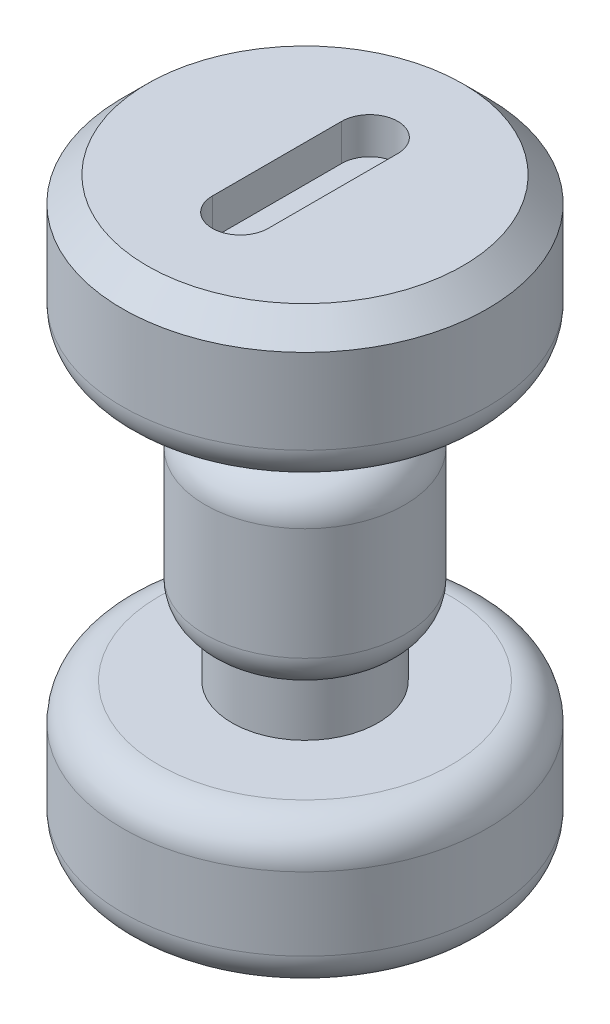
ISO-10303-21;
HEADER;
FILE_DESCRIPTION(('STEP AP214'),'2;1');
FILE_NAME('part.step','',(''),(''),'','','');
FILE_SCHEMA(('AUTOMOTIVE_DESIGN { 1 0 10303 214 1 1 1 1 }'));
ENDSEC;
DATA;
#1=APPLICATION_CONTEXT('core data for automotive mechanical design processes');
#2=APPLICATION_PROTOCOL_DEFINITION('international standard','automotive_design',2000,#1);
#3=PRODUCT_CONTEXT('',#1,'mechanical');
#4=PRODUCT('Part','Part','',(#3));
#5=PRODUCT_RELATED_PRODUCT_CATEGORY('part','',(#4));
#6=PRODUCT_DEFINITION_FORMATION('','',#4);
#7=PRODUCT_DEFINITION_CONTEXT('part definition',#1,'design');
#8=PRODUCT_DEFINITION('design','',#6,#7);
#9=PRODUCT_DEFINITION_SHAPE('','',#8);
#10=(LENGTH_UNIT() NAMED_UNIT(*) SI_UNIT(.MILLI.,.METRE.));
#11=(NAMED_UNIT(*) PLANE_ANGLE_UNIT() SI_UNIT($,.RADIAN.));
#12=(NAMED_UNIT(*) SI_UNIT($,.STERADIAN.) SOLID_ANGLE_UNIT());
#13=UNCERTAINTY_MEASURE_WITH_UNIT(LENGTH_MEASURE(1.E-05),#10,'distance_accuracy_value','');
#14=(GEOMETRIC_REPRESENTATION_CONTEXT(3) GLOBAL_UNCERTAINTY_ASSIGNED_CONTEXT((#13)) GLOBAL_UNIT_ASSIGNED_CONTEXT((#10,
#11,#12)) REPRESENTATION_CONTEXT('',''));
#15=CARTESIAN_POINT('',(0.,0.,0.));
#16=DIRECTION('',(0.,0.,1.));
#17=DIRECTION('',(1.,0.,0.));
#18=AXIS2_PLACEMENT_3D('',#15,#16,#17);
#19=CARTESIAN_POINT('',(0.,80.,0.));
#20=DIRECTION('',(0.,1.,0.));
#21=DIRECTION('',(-1.,0.,0.));
#22=AXIS2_PLACEMENT_3D('',#19,#20,#21);
#23=CYLINDRICAL_SURFACE('',#22,25.);
#24=CARTESIAN_POINT('',(0.,65.,0.));
#25=DIRECTION('',(0.,-1.,0.));
#26=DIRECTION('',(1.,0.,0.));
#27=AXIS2_PLACEMENT_3D('',#24,#25,#26);
#28=CIRCLE('',#27,25.);
#29=CARTESIAN_POINT('',(25.,65.,0.));
#30=VERTEX_POINT('',#29);
#31=EDGE_CURVE('E156',#30,#30,#28,.F.);
#32=ORIENTED_EDGE('',*,*,#31,.T.);
#33=EDGE_LOOP('',(#32));
#34=FACE_BOUND('',#33,.T.);
#35=CARTESIAN_POINT('',(0.,76.6080063457044,0.));
#36=DIRECTION('',(0.,-1.,0.));
#37=DIRECTION('',(0.,0.,-1.));
#38=AXIS2_PLACEMENT_3D('',#35,#36,#37);
#39=CIRCLE('',#38,25.);
#40=CARTESIAN_POINT('',(0.,76.6080063457044,-25.));
#41=VERTEX_POINT('',#40);
#42=EDGE_CURVE('E118',#41,#41,#39,.T.);
#43=ORIENTED_EDGE('',*,*,#42,.T.);
#44=EDGE_LOOP('',(#43));
#45=FACE_BOUND('',#44,.T.);
#46=ADVANCED_FACE('F39',(#34,#45),#23,.T.);
#47=CARTESIAN_POINT('',(0.,80.,0.));
#48=DIRECTION('',(0.,1.,0.));
#49=DIRECTION('',(-1.,0.,0.));
#50=AXIS2_PLACEMENT_3D('',#47,#48,#49);
#51=CYLINDRICAL_SURFACE('',#50,9.99999999999999);
#52=CARTESIAN_POINT('',(0.,20.,0.));
#53=DIRECTION('',(0.,1.,0.));
#54=DIRECTION('',(-1.,0.,0.));
#55=AXIS2_PLACEMENT_3D('',#52,#53,#54);
#56=CIRCLE('',#55,9.99999999999999);
#57=CARTESIAN_POINT('',(-9.99999999999999,20.,0.));
#58=VERTEX_POINT('',#57);
#59=EDGE_CURVE('E137',#58,#58,#56,.T.);
#60=ORIENTED_EDGE('',*,*,#59,.T.);
#61=EDGE_LOOP('',(#60));
#62=FACE_BOUND('',#61,.T.);
#63=CARTESIAN_POINT('',(0.,27.5,0.));
#64=DIRECTION('',(0.,1.,0.));
#65=DIRECTION('',(-1.,0.,0.));
#66=AXIS2_PLACEMENT_3D('',#63,#64,#65);
#67=CIRCLE('',#66,9.99999999999999);
#68=CARTESIAN_POINT('',(-9.99999999999999,27.5,0.));
#69=VERTEX_POINT('',#68);
#70=EDGE_CURVE('E128',#69,#69,#67,.F.);
#71=ORIENTED_EDGE('',*,*,#70,.T.);
#72=EDGE_LOOP('',(#71));
#73=FACE_BOUND('',#72,.T.);
#74=ADVANCED_FACE('F191',(#62,#73),#51,.T.);
#75=CARTESIAN_POINT('',(0.,0.,0.));
#76=DIRECTION('',(0.,-1.,0.));
#77=DIRECTION('',(1.,0.,0.));
#78=AXIS2_PLACEMENT_3D('',#75,#76,#77);
#79=PLANE('',#78);
#80=CARTESIAN_POINT('',(0.,0.,0.));
#81=DIRECTION('',(0.,-1.,0.));
#82=DIRECTION('',(1.,0.,0.));
#83=AXIS2_PLACEMENT_3D('',#80,#81,#82);
#84=CIRCLE('',#83,20.);
#85=CARTESIAN_POINT('',(20.,0.,0.));
#86=VERTEX_POINT('',#85);
#87=EDGE_CURVE('E11',#86,#86,#84,.T.);
#88=ORIENTED_EDGE('',*,*,#87,.T.);
#89=EDGE_LOOP('',(#88));
#90=FACE_BOUND('',#89,.T.);
#91=ADVANCED_FACE('F194',(#90),#79,.T.);
#92=CARTESIAN_POINT('',(0.,80.,0.));
#93=DIRECTION('',(0.,1.,0.));
#94=DIRECTION('',(-1.,0.,0.));
#95=AXIS2_PLACEMENT_3D('',#92,#93,#94);
#96=CYLINDRICAL_SURFACE('',#95,25.);
#97=CARTESIAN_POINT('',(0.,15.,0.));
#98=DIRECTION('',(0.,1.,0.));
#99=DIRECTION('',(-1.,0.,0.));
#100=AXIS2_PLACEMENT_3D('',#97,#98,#99);
#101=CIRCLE('',#100,25.);
#102=CARTESIAN_POINT('',(-25.,15.,0.));
#103=VERTEX_POINT('',#102);
#104=EDGE_CURVE('E48',#103,#103,#101,.F.);
#105=ORIENTED_EDGE('',*,*,#104,.T.);
#106=EDGE_LOOP('',(#105));
#107=FACE_BOUND('',#106,.T.);
#108=CARTESIAN_POINT('',(0.,5.,0.));
#109=DIRECTION('',(0.,-1.,0.));
#110=DIRECTION('',(1.,0.,0.));
#111=AXIS2_PLACEMENT_3D('',#108,#109,#110);
#112=CIRCLE('',#111,25.);
#113=CARTESIAN_POINT('',(25.,5.,0.));
#114=VERTEX_POINT('',#113);
#115=EDGE_CURVE('E168',#114,#114,#112,.F.);
#116=ORIENTED_EDGE('',*,*,#115,.T.);
#117=EDGE_LOOP('',(#116));
#118=FACE_BOUND('',#117,.T.);
#119=ADVANCED_FACE('F175',(#107,#118),#96,.T.);
#120=CARTESIAN_POINT('',(-25.,20.,0.));
#121=DIRECTION('',(0.,1.,0.));
#122=DIRECTION('',(-1.,0.,0.));
#123=AXIS2_PLACEMENT_3D('',#120,#121,#122);
#124=PLANE('',#123);
#125=CARTESIAN_POINT('',(0.,20.,0.));
#126=DIRECTION('',(0.,1.,0.));
#127=DIRECTION('',(-1.,0.,0.));
#128=AXIS2_PLACEMENT_3D('',#125,#126,#127);
#129=CIRCLE('',#128,20.);
#130=CARTESIAN_POINT('',(-20.,20.,0.));
#131=VERTEX_POINT('',#130);
#132=EDGE_CURVE('E164',#131,#131,#129,.T.);
#133=ORIENTED_EDGE('',*,*,#132,.T.);
#134=EDGE_LOOP('',(#133));
#135=FACE_BOUND('',#134,.T.);
#136=ORIENTED_EDGE('',*,*,#59,.F.);
#137=EDGE_LOOP('',(#136));
#138=FACE_BOUND('',#137,.T.);
#139=ADVANCED_FACE('F184',(#135,#138),#124,.T.);
#140=CARTESIAN_POINT('',(0.,27.5,0.));
#141=DIRECTION('',(0.,1.,0.));
#142=DIRECTION('',(-1.,0.,0.));
#143=AXIS2_PLACEMENT_3D('',#140,#141,#142);
#144=CYLINDRICAL_SURFACE('',#143,13.6618793522469);
#145=CARTESIAN_POINT('',(0.,32.3176169557217,0.));
#146=DIRECTION('',(0.,-1.,0.));
#147=DIRECTION('',(1.,0.,0.));
#148=AXIS2_PLACEMENT_3D('',#145,#146,#147);
#149=CIRCLE('',#148,13.6618793522469);
#150=CARTESIAN_POINT('',(13.6618793522469,32.3176169557217,0.));
#151=VERTEX_POINT('',#150);
#152=EDGE_CURVE('E152',#151,#151,#149,.F.);
#153=ORIENTED_EDGE('',*,*,#152,.T.);
#154=EDGE_LOOP('',(#153));
#155=FACE_BOUND('',#154,.T.);
#156=CARTESIAN_POINT('',(0.,47.6823830442783,0.));
#157=DIRECTION('',(0.,1.,0.));
#158=DIRECTION('',(-1.,0.,0.));
#159=AXIS2_PLACEMENT_3D('',#156,#157,#158);
#160=CIRCLE('',#159,13.6618793522469);
#161=CARTESIAN_POINT('',(-13.6618793522469,47.6823830442783,0.));
#162=VERTEX_POINT('',#161);
#163=EDGE_CURVE('E145',#162,#162,#160,.F.);
#164=ORIENTED_EDGE('',*,*,#163,.T.);
#165=EDGE_LOOP('',(#164));
#166=FACE_BOUND('',#165,.T.);
#167=ADVANCED_FACE('F187',(#155,#166),#144,.T.);
#168=CARTESIAN_POINT('',(-9.99999999999999,60.,0.));
#169=DIRECTION('',(0.,-1.,0.));
#170=DIRECTION('',(1.,0.,0.));
#171=AXIS2_PLACEMENT_3D('',#168,#169,#170);
#172=PLANE('',#171);
#173=CARTESIAN_POINT('',(0.,60.,0.));
#174=DIRECTION('',(0.,-1.,0.));
#175=DIRECTION('',(1.,0.,0.));
#176=AXIS2_PLACEMENT_3D('',#173,#174,#175);
#177=CIRCLE('',#176,20.);
#178=CARTESIAN_POINT('',(20.,60.,0.));
#179=VERTEX_POINT('',#178);
#180=EDGE_CURVE('E160',#179,#179,#177,.T.);
#181=ORIENTED_EDGE('',*,*,#180,.T.);
#182=EDGE_LOOP('',(#181));
#183=FACE_BOUND('',#182,.T.);
#184=CARTESIAN_POINT('',(0.,60.,0.));
#185=DIRECTION('',(0.,1.,0.));
#186=DIRECTION('',(-1.,0.,0.));
#187=AXIS2_PLACEMENT_3D('',#184,#185,#186);
#188=CIRCLE('',#187,9.99999999999999);
#189=CARTESIAN_POINT('',(-9.99999999999999,60.,0.));
#190=VERTEX_POINT('',#189);
#191=EDGE_CURVE('E133',#190,#190,#188,.T.);
#192=ORIENTED_EDGE('',*,*,#191,.T.);
#193=EDGE_LOOP('',(#192));
#194=FACE_BOUND('',#193,.T.);
#195=ADVANCED_FACE('F209',(#183,#194),#172,.T.);
#196=CARTESIAN_POINT('',(0.,52.5,0.));
#197=DIRECTION('',(0.,1.,0.));
#198=DIRECTION('',(-1.,0.,0.));
#199=AXIS2_PLACEMENT_3D('',#196,#197,#198);
#200=CIRCLE('',#199,9.99999999999999);
#201=CARTESIAN_POINT('',(-9.99999999999999,52.5,0.));
#202=VERTEX_POINT('',#201);
#203=EDGE_CURVE('E141',#202,#202,#200,.F.);
#204=ORIENTED_EDGE('',*,*,#203,.F.);
#205=EDGE_LOOP('',(#204));
#206=FACE_BOUND('',#205,.T.);
#207=ORIENTED_EDGE('',*,*,#191,.F.);
#208=EDGE_LOOP('',(#207));
#209=FACE_BOUND('',#208,.T.);
#210=ADVANCED_FACE('F196',(#206,#209),#51,.T.);
#211=CARTESIAN_POINT('',(0.,76.6080063457044,0.));
#212=DIRECTION('',(0.,-1.,0.));
#213=DIRECTION('',(0.,0.,-1.));
#214=AXIS2_PLACEMENT_3D('',#211,#212,#213);
#215=CONICAL_SURFACE('',#214,25.,0.785398163397428);
#216=CARTESIAN_POINT('',(0.,80.,0.));
#217=DIRECTION('',(0.,-1.,0.));
#218=DIRECTION('',(0.,0.,-1.));
#219=AXIS2_PLACEMENT_3D('',#216,#217,#218);
#220=CIRCLE('',#219,21.6080063457046);
#221=CARTESIAN_POINT('',(0.,80.,-21.6080063457046));
#222=VERTEX_POINT('',#221);
#223=EDGE_CURVE('E257',#222,#222,#220,.T.);
#224=ORIENTED_EDGE('',*,*,#223,.T.);
#225=EDGE_LOOP('',(#224));
#226=FACE_BOUND('',#225,.T.);
#227=ORIENTED_EDGE('',*,*,#42,.F.);
#228=EDGE_LOOP('',(#227));
#229=FACE_BOUND('',#228,.T.);
#230=ADVANCED_FACE('F220',(#226,#229),#215,.T.);
#231=CARTESIAN_POINT('',(0.,75.,8.86520898803492));
#232=DIRECTION('',(0.,1.,0.));
#233=DIRECTION('',(-1.,0.,0.));
#234=AXIS2_PLACEMENT_3D('',#231,#232,#233);
#235=PLANE('',#234);
#236=CARTESIAN_POINT('',(0.,75.,8.86520898803492));
#237=DIRECTION('',(0.,1.,0.));
#238=DIRECTION('',(-1.,0.,0.));
#239=AXIS2_PLACEMENT_3D('',#236,#237,#238);
#240=CIRCLE('',#239,3.83415217102643);
#241=CARTESIAN_POINT('',(-3.83415217102643,75.,8.86520898803492));
#242=VERTEX_POINT('',#241);
#243=CARTESIAN_POINT('',(3.83415217102643,75.,8.86520898803492));
#244=VERTEX_POINT('',#243);
#245=EDGE_CURVE('E106',#242,#244,#240,.T.);
#246=ORIENTED_EDGE('',*,*,#245,.T.);
#247=DIRECTION('',(0.,0.,-1.));
#248=VECTOR('',#247,1.);
#249=CARTESIAN_POINT('',(3.83415217102643,75.,8.86520898803492));
#250=LINE('',#249,#248);
#251=CARTESIAN_POINT('',(3.83415217102643,75.,-8.86520898803492));
#252=VERTEX_POINT('',#251);
#253=EDGE_CURVE('E87',#244,#252,#250,.T.);
#254=ORIENTED_EDGE('',*,*,#253,.T.);
#255=CARTESIAN_POINT('',(0.,75.,-8.86520898803492));
#256=DIRECTION('',(0.,1.,0.));
#257=DIRECTION('',(-1.,0.,0.));
#258=AXIS2_PLACEMENT_3D('',#255,#256,#257);
#259=CIRCLE('',#258,3.83415217102643);
#260=CARTESIAN_POINT('',(-3.83415217102643,75.,-8.86520898803492));
#261=VERTEX_POINT('',#260);
#262=EDGE_CURVE('E98',#252,#261,#259,.T.);
#263=ORIENTED_EDGE('',*,*,#262,.T.);
#264=DIRECTION('',(0.,0.,1.));
#265=VECTOR('',#264,1.);
#266=CARTESIAN_POINT('',(-3.83415217102643,75.,8.86520898803492));
#267=LINE('',#266,#265);
#268=EDGE_CURVE('E103',#261,#242,#267,.T.);
#269=ORIENTED_EDGE('',*,*,#268,.T.);
#270=EDGE_LOOP('',(#246,#254,#263,#269));
#271=FACE_BOUND('',#270,.T.);
#272=ADVANCED_FACE('F105',(#271),#235,.T.);
#273=CARTESIAN_POINT('',(3.83415217102643,75.,8.86520898803492));
#274=DIRECTION('',(1.,0.,0.));
#275=DIRECTION('',(0.,1.,0.));
#276=AXIS2_PLACEMENT_3D('',#273,#274,#275);
#277=PLANE('',#276);
#278=DIRECTION('',(0.,0.,-1.));
#279=VECTOR('',#278,1.);
#280=CARTESIAN_POINT('',(3.83415217102643,80.,8.86520898803492));
#281=LINE('',#280,#279);
#282=CARTESIAN_POINT('',(3.83415217102643,80.,8.86520898803492));
#283=VERTEX_POINT('',#282);
#284=CARTESIAN_POINT('',(3.83415217102643,80.,-8.86520898803492));
#285=VERTEX_POINT('',#284);
#286=EDGE_CURVE('E90',#283,#285,#281,.T.);
#287=ORIENTED_EDGE('',*,*,#286,.T.);
#288=DIRECTION('',(0.,1.,0.));
#289=VECTOR('',#288,1.);
#290=CARTESIAN_POINT('',(3.83415217102643,75.,-8.86520898803492));
#291=LINE('',#290,#289);
#292=EDGE_CURVE('E83',#252,#285,#291,.T.);
#293=ORIENTED_EDGE('',*,*,#292,.F.);
#294=ORIENTED_EDGE('',*,*,#253,.F.);
#295=DIRECTION('',(0.,1.,0.));
#296=VECTOR('',#295,1.);
#297=CARTESIAN_POINT('',(3.83415217102643,75.,8.86520898803492));
#298=LINE('',#297,#296);
#299=EDGE_CURVE('E78',#244,#283,#298,.T.);
#300=ORIENTED_EDGE('',*,*,#299,.T.);
#301=EDGE_LOOP('',(#287,#293,#294,#300));
#302=FACE_BOUND('',#301,.T.);
#303=ADVANCED_FACE('F85',(#302),#277,.F.);
#304=CARTESIAN_POINT('',(0.,75.,-8.86520898803492));
#305=DIRECTION('',(0.,1.,0.));
#306=DIRECTION('',(-1.,0.,0.));
#307=AXIS2_PLACEMENT_3D('',#304,#305,#306);
#308=CYLINDRICAL_SURFACE('',#307,3.83415217102643);
#309=CARTESIAN_POINT('',(0.,80.,-8.86520898803492));
#310=DIRECTION('',(0.,1.,0.));
#311=DIRECTION('',(-1.,0.,0.));
#312=AXIS2_PLACEMENT_3D('',#309,#310,#311);
#313=CIRCLE('',#312,3.83415217102643);
#314=CARTESIAN_POINT('',(-3.83415217102643,80.,-8.86520898803492));
#315=VERTEX_POINT('',#314);
#316=EDGE_CURVE('E121',#285,#315,#313,.T.);
#317=ORIENTED_EDGE('',*,*,#316,.T.);
#318=DIRECTION('',(0.,1.,0.));
#319=VECTOR('',#318,1.);
#320=CARTESIAN_POINT('',(-3.83415217102643,75.,-8.86520898803492));
#321=LINE('',#320,#319);
#322=EDGE_CURVE('E95',#261,#315,#321,.T.);
#323=ORIENTED_EDGE('',*,*,#322,.F.);
#324=ORIENTED_EDGE('',*,*,#262,.F.);
#325=ORIENTED_EDGE('',*,*,#292,.T.);
#326=EDGE_LOOP('',(#317,#323,#324,#325));
#327=FACE_BOUND('',#326,.T.);
#328=ADVANCED_FACE('F99',(#327),#308,.F.);
#329=CARTESIAN_POINT('',(-3.83415217102643,75.,8.86520898803492));
#330=DIRECTION('',(-1.,0.,0.));
#331=DIRECTION('',(0.,-1.,0.));
#332=AXIS2_PLACEMENT_3D('',#329,#330,#331);
#333=PLANE('',#332);
#334=DIRECTION('',(0.,0.,1.));
#335=VECTOR('',#334,1.);
#336=CARTESIAN_POINT('',(-3.83415217102643,80.,8.86520898803492));
#337=LINE('',#336,#335);
#338=CARTESIAN_POINT('',(-3.83415217102643,80.,8.86520898803492));
#339=VERTEX_POINT('',#338);
#340=EDGE_CURVE('E110',#315,#339,#337,.T.);
#341=ORIENTED_EDGE('',*,*,#340,.T.);
#342=DIRECTION('',(0.,1.,0.));
#343=VECTOR('',#342,1.);
#344=CARTESIAN_POINT('',(-3.83415217102643,75.,8.86520898803492));
#345=LINE('',#344,#343);
#346=EDGE_CURVE('E63',#242,#339,#345,.T.);
#347=ORIENTED_EDGE('',*,*,#346,.F.);
#348=ORIENTED_EDGE('',*,*,#268,.F.);
#349=ORIENTED_EDGE('',*,*,#322,.T.);
#350=EDGE_LOOP('',(#341,#347,#348,#349));
#351=FACE_BOUND('',#350,.T.);
#352=ADVANCED_FACE('F241',(#351),#333,.F.);
#353=CARTESIAN_POINT('',(0.,75.,8.86520898803492));
#354=DIRECTION('',(0.,1.,0.));
#355=DIRECTION('',(-1.,0.,0.));
#356=AXIS2_PLACEMENT_3D('',#353,#354,#355);
#357=CYLINDRICAL_SURFACE('',#356,3.83415217102643);
#358=CARTESIAN_POINT('',(0.,80.,8.86520898803492));
#359=DIRECTION('',(0.,1.,0.));
#360=DIRECTION('',(-1.,0.,0.));
#361=AXIS2_PLACEMENT_3D('',#358,#359,#360);
#362=CIRCLE('',#361,3.83415217102643);
#363=EDGE_CURVE('E55',#339,#283,#362,.T.);
#364=ORIENTED_EDGE('',*,*,#363,.T.);
#365=ORIENTED_EDGE('',*,*,#299,.F.);
#366=ORIENTED_EDGE('',*,*,#245,.F.);
#367=ORIENTED_EDGE('',*,*,#346,.T.);
#368=EDGE_LOOP('',(#364,#365,#366,#367));
#369=FACE_BOUND('',#368,.T.);
#370=ADVANCED_FACE('F236',(#369),#357,.F.);
#371=CARTESIAN_POINT('',(-25.,80.,0.));
#372=DIRECTION('',(0.,1.,0.));
#373=DIRECTION('',(-1.,0.,0.));
#374=AXIS2_PLACEMENT_3D('',#371,#372,#373);
#375=PLANE('',#374);
#376=ORIENTED_EDGE('',*,*,#363,.F.);
#377=ORIENTED_EDGE('',*,*,#340,.F.);
#378=ORIENTED_EDGE('',*,*,#316,.F.);
#379=ORIENTED_EDGE('',*,*,#286,.F.);
#380=EDGE_LOOP('',(#376,#377,#378,#379));
#381=FACE_BOUND('',#380,.T.);
#382=ORIENTED_EDGE('',*,*,#223,.F.);
#383=EDGE_LOOP('',(#382));
#384=FACE_BOUND('',#383,.T.);
#385=ADVANCED_FACE('F203',(#381,#384),#375,.T.);
#386=CARTESIAN_POINT('',(0.,32.3176169557217,0.));
#387=DIRECTION('',(0.,-1.,0.));
#388=DIRECTION('',(1.,0.,0.));
#389=AXIS2_PLACEMENT_3D('',#386,#387,#388);
#390=TOROIDAL_SURFACE('',#389,8.66187935224688,5.);
#391=ORIENTED_EDGE('',*,*,#70,.F.);
#392=EDGE_LOOP('',(#391));
#393=FACE_BOUND('',#392,.T.);
#394=ORIENTED_EDGE('',*,*,#152,.F.);
#395=EDGE_LOOP('',(#394));
#396=FACE_BOUND('',#395,.T.);
#397=ADVANCED_FACE('F199',(#393,#396),#390,.T.);
#398=CARTESIAN_POINT('',(0.,47.6823830442783,0.));
#399=DIRECTION('',(0.,1.,0.));
#400=DIRECTION('',(-1.,0.,0.));
#401=AXIS2_PLACEMENT_3D('',#398,#399,#400);
#402=TOROIDAL_SURFACE('',#401,8.66187935224688,5.);
#403=ORIENTED_EDGE('',*,*,#163,.F.);
#404=EDGE_LOOP('',(#403));
#405=FACE_BOUND('',#404,.T.);
#406=ORIENTED_EDGE('',*,*,#203,.T.);
#407=EDGE_LOOP('',(#406));
#408=FACE_BOUND('',#407,.T.);
#409=ADVANCED_FACE('F202',(#405,#408),#402,.T.);
#410=CARTESIAN_POINT('',(0.,65.,0.));
#411=DIRECTION('',(0.,-1.,0.));
#412=DIRECTION('',(1.,0.,0.));
#413=AXIS2_PLACEMENT_3D('',#410,#411,#412);
#414=TOROIDAL_SURFACE('',#413,20.,5.);
#415=ORIENTED_EDGE('',*,*,#180,.F.);
#416=EDGE_LOOP('',(#415));
#417=FACE_BOUND('',#416,.T.);
#418=ORIENTED_EDGE('',*,*,#31,.F.);
#419=EDGE_LOOP('',(#418));
#420=FACE_BOUND('',#419,.T.);
#421=ADVANCED_FACE('F181',(#417,#420),#414,.T.);
#422=CARTESIAN_POINT('',(0.,15.,0.));
#423=DIRECTION('',(0.,1.,0.));
#424=DIRECTION('',(-1.,0.,0.));
#425=AXIS2_PLACEMENT_3D('',#422,#423,#424);
#426=TOROIDAL_SURFACE('',#425,20.,5.);
#427=ORIENTED_EDGE('',*,*,#104,.F.);
#428=EDGE_LOOP('',(#427));
#429=FACE_BOUND('',#428,.T.);
#430=ORIENTED_EDGE('',*,*,#132,.F.);
#431=EDGE_LOOP('',(#430));
#432=FACE_BOUND('',#431,.T.);
#433=ADVANCED_FACE('F178',(#429,#432),#426,.T.);
#434=CARTESIAN_POINT('',(0.,5.,0.));
#435=DIRECTION('',(0.,-1.,0.));
#436=DIRECTION('',(1.,0.,0.));
#437=AXIS2_PLACEMENT_3D('',#434,#435,#436);
#438=TOROIDAL_SURFACE('',#437,20.,5.);
#439=ORIENTED_EDGE('',*,*,#87,.F.);
#440=EDGE_LOOP('',(#439));
#441=FACE_BOUND('',#440,.T.);
#442=ORIENTED_EDGE('',*,*,#115,.F.);
#443=EDGE_LOOP('',(#442));
#444=FACE_BOUND('',#443,.T.);
#445=ADVANCED_FACE('F41',(#441,#444),#438,.T.);
#446=CLOSED_SHELL('',(#46,#74,#91,#119,#139,#167,#195,#210,#230,#272,#303,#328,#352,#370,#385,
#397,#409,#421,#433,#445));
#447=MANIFOLD_SOLID_BREP('B2',#446);
#448=ADVANCED_BREP_SHAPE_REPRESENTATION('',(#18,#447),#14);
#449=SHAPE_DEFINITION_REPRESENTATION(#9,#448);
ENDSEC;
END-ISO-10303-21;
